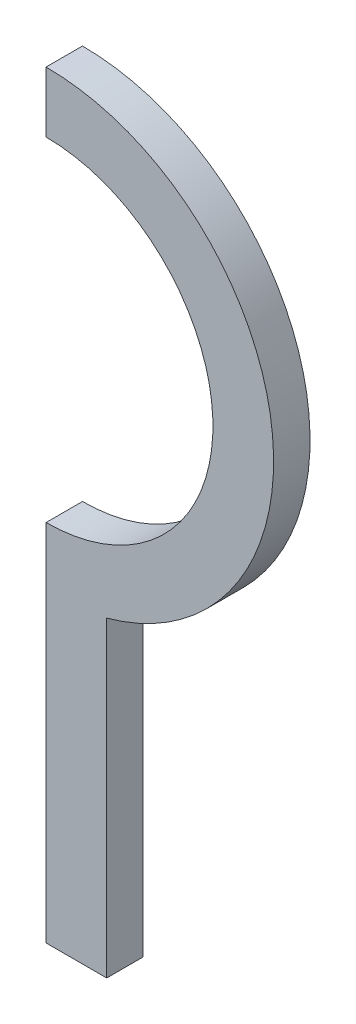
ISO-10303-21;
HEADER;
FILE_DESCRIPTION(('STEP AP214'),'2;1');
FILE_NAME('part.step','',(''),(''),'','','');
FILE_SCHEMA(('AUTOMOTIVE_DESIGN { 1 0 10303 214 1 1 1 1 }'));
ENDSEC;
DATA;
#1=APPLICATION_CONTEXT('core data for automotive mechanical design processes');
#2=APPLICATION_PROTOCOL_DEFINITION('international standard','automotive_design',2000,#1);
#3=PRODUCT_CONTEXT('',#1,'mechanical');
#4=PRODUCT('Part','Part','',(#3));
#5=PRODUCT_RELATED_PRODUCT_CATEGORY('part','',(#4));
#6=PRODUCT_DEFINITION_FORMATION('','',#4);
#7=PRODUCT_DEFINITION_CONTEXT('part definition',#1,'design');
#8=PRODUCT_DEFINITION('design','',#6,#7);
#9=PRODUCT_DEFINITION_SHAPE('','',#8);
#10=(LENGTH_UNIT() NAMED_UNIT(*) SI_UNIT(.MILLI.,.METRE.));
#11=(NAMED_UNIT(*) PLANE_ANGLE_UNIT() SI_UNIT($,.RADIAN.));
#12=(NAMED_UNIT(*) SI_UNIT($,.STERADIAN.) SOLID_ANGLE_UNIT());
#13=UNCERTAINTY_MEASURE_WITH_UNIT(LENGTH_MEASURE(1.E-05),#10,'distance_accuracy_value','');
#14=(GEOMETRIC_REPRESENTATION_CONTEXT(3) GLOBAL_UNCERTAINTY_ASSIGNED_CONTEXT((#13)) GLOBAL_UNIT_ASSIGNED_CONTEXT((#10,
#11,#12)) REPRESENTATION_CONTEXT('',''));
#15=CARTESIAN_POINT('',(0.,0.,0.));
#16=DIRECTION('',(0.,0.,1.));
#17=DIRECTION('',(1.,0.,0.));
#18=AXIS2_PLACEMENT_3D('',#15,#16,#17);
#19=CARTESIAN_POINT('',(5.,-25.,6.));
#20=DIRECTION('',(0.,1.,0.));
#21=DIRECTION('',(0.,0.,1.));
#22=AXIS2_PLACEMENT_3D('',#19,#20,#21);
#23=PLANE('',#22);
#24=DIRECTION('',(1.,0.,0.));
#25=VECTOR('',#24,1.);
#26=CARTESIAN_POINT('',(5.,-25.,0.));
#27=LINE('',#26,#25);
#28=CARTESIAN_POINT('',(-5.,-25.,0.));
#29=VERTEX_POINT('',#28);
#30=CARTESIAN_POINT('',(5.,-25.,0.));
#31=VERTEX_POINT('',#30);
#32=EDGE_CURVE('E127',#29,#31,#27,.T.);
#33=ORIENTED_EDGE('',*,*,#32,.T.);
#34=DIRECTION('',(0.,0.,-1.));
#35=VECTOR('',#34,1.);
#36=CARTESIAN_POINT('',(5.,-25.,6.));
#37=LINE('',#36,#35);
#38=CARTESIAN_POINT('',(5.,-25.,6.));
#39=VERTEX_POINT('',#38);
#40=EDGE_CURVE('E11',#39,#31,#37,.T.);
#41=ORIENTED_EDGE('',*,*,#40,.F.);
#42=DIRECTION('',(1.,0.,0.));
#43=VECTOR('',#42,1.);
#44=CARTESIAN_POINT('',(5.,-25.,6.));
#45=LINE('',#44,#43);
#46=CARTESIAN_POINT('',(-5.,-25.,6.));
#47=VERTEX_POINT('',#46);
#48=EDGE_CURVE('E138',#47,#39,#45,.T.);
#49=ORIENTED_EDGE('',*,*,#48,.F.);
#50=DIRECTION('',(0.,0.,-1.));
#51=VECTOR('',#50,1.);
#52=CARTESIAN_POINT('',(-5.,-25.,6.));
#53=LINE('',#52,#51);
#54=EDGE_CURVE('E123',#47,#29,#53,.T.);
#55=ORIENTED_EDGE('',*,*,#54,.T.);
#56=EDGE_LOOP('',(#33,#41,#49,#55));
#57=FACE_BOUND('',#56,.T.);
#58=ADVANCED_FACE('F42',(#57),#23,.F.);
#59=CARTESIAN_POINT('',(5.,25.,6.));
#60=DIRECTION('',(-1.,0.,0.));
#61=DIRECTION('',(0.,-1.,0.));
#62=AXIS2_PLACEMENT_3D('',#59,#60,#61);
#63=PLANE('',#62);
#64=DIRECTION('',(0.,1.,0.));
#65=VECTOR('',#64,1.);
#66=CARTESIAN_POINT('',(5.,25.,0.));
#67=LINE('',#66,#65);
#68=CARTESIAN_POINT('',(4.99999999999998,26.3579192629976,0.));
#69=VERTEX_POINT('',#68);
#70=EDGE_CURVE('E130',#31,#69,#67,.T.);
#71=ORIENTED_EDGE('',*,*,#70,.T.);
#72=DIRECTION('',(0.,0.,-1.));
#73=VECTOR('',#72,1.);
#74=CARTESIAN_POINT('',(4.99999999999998,26.3579192629976,6.));
#75=LINE('',#74,#73);
#76=CARTESIAN_POINT('',(4.99999999999998,26.3579192629976,6.));
#77=VERTEX_POINT('',#76);
#78=EDGE_CURVE('E50',#77,#69,#75,.T.);
#79=ORIENTED_EDGE('',*,*,#78,.F.);
#80=DIRECTION('',(0.,1.,0.));
#81=VECTOR('',#80,1.);
#82=CARTESIAN_POINT('',(5.,25.,6.));
#83=LINE('',#82,#81);
#84=EDGE_CURVE('E93',#39,#77,#83,.T.);
#85=ORIENTED_EDGE('',*,*,#84,.F.);
#86=ORIENTED_EDGE('',*,*,#40,.T.);
#87=EDGE_LOOP('',(#71,#79,#85,#86));
#88=FACE_BOUND('',#87,.T.);
#89=ADVANCED_FACE('F152',(#88),#63,.F.);
#90=CARTESIAN_POINT('',(-5.00000000000001,62.5,6.));
#91=DIRECTION('',(0.,0.,-1.));
#92=DIRECTION('',(-1.,0.,0.));
#93=AXIS2_PLACEMENT_3D('',#90,#91,#92);
#94=CYLINDRICAL_SURFACE('',#93,37.5);
#95=CARTESIAN_POINT('',(-5.00000000000001,62.5,0.));
#96=DIRECTION('',(0.,0.,1.));
#97=DIRECTION('',(1.,0.,0.));
#98=AXIS2_PLACEMENT_3D('',#95,#96,#97);
#99=CIRCLE('',#98,37.5);
#100=CARTESIAN_POINT('',(-5.00000000000001,100.,0.));
#101=VERTEX_POINT('',#100);
#102=EDGE_CURVE('E132',#69,#101,#99,.T.);
#103=ORIENTED_EDGE('',*,*,#102,.T.);
#104=DIRECTION('',(0.,0.,-1.));
#105=VECTOR('',#104,1.);
#106=CARTESIAN_POINT('',(-5.00000000000001,100.,6.));
#107=LINE('',#106,#105);
#108=CARTESIAN_POINT('',(-5.00000000000001,100.,6.));
#109=VERTEX_POINT('',#108);
#110=EDGE_CURVE('E118',#109,#101,#107,.T.);
#111=ORIENTED_EDGE('',*,*,#110,.F.);
#112=CARTESIAN_POINT('',(-5.00000000000001,62.5,6.));
#113=DIRECTION('',(0.,0.,1.));
#114=DIRECTION('',(1.,0.,0.));
#115=AXIS2_PLACEMENT_3D('',#112,#113,#114);
#116=CIRCLE('',#115,37.5);
#117=EDGE_CURVE('E107',#77,#109,#116,.T.);
#118=ORIENTED_EDGE('',*,*,#117,.F.);
#119=ORIENTED_EDGE('',*,*,#78,.T.);
#120=EDGE_LOOP('',(#103,#111,#118,#119));
#121=FACE_BOUND('',#120,.T.);
#122=ADVANCED_FACE('F144',(#121),#94,.T.);
#123=CARTESIAN_POINT('',(-5.00000000000001,90.,6.));
#124=DIRECTION('',(1.,0.,0.));
#125=DIRECTION('',(0.,0.,-1.));
#126=AXIS2_PLACEMENT_3D('',#123,#124,#125);
#127=PLANE('',#126);
#128=DIRECTION('',(0.,-1.,0.));
#129=VECTOR('',#128,1.);
#130=CARTESIAN_POINT('',(-5.00000000000001,90.,0.));
#131=LINE('',#130,#129);
#132=CARTESIAN_POINT('',(-5.00000000000001,90.,0.));
#133=VERTEX_POINT('',#132);
#134=EDGE_CURVE('E116',#101,#133,#131,.T.);
#135=ORIENTED_EDGE('',*,*,#134,.T.);
#136=DIRECTION('',(0.,0.,-1.));
#137=VECTOR('',#136,1.);
#138=CARTESIAN_POINT('',(-5.00000000000001,90.,6.));
#139=LINE('',#138,#137);
#140=CARTESIAN_POINT('',(-5.00000000000001,90.,6.));
#141=VERTEX_POINT('',#140);
#142=EDGE_CURVE('E113',#141,#133,#139,.T.);
#143=ORIENTED_EDGE('',*,*,#142,.F.);
#144=DIRECTION('',(0.,-1.,0.));
#145=VECTOR('',#144,1.);
#146=CARTESIAN_POINT('',(-5.00000000000001,90.,6.));
#147=LINE('',#146,#145);
#148=EDGE_CURVE('E100',#109,#141,#147,.T.);
#149=ORIENTED_EDGE('',*,*,#148,.F.);
#150=ORIENTED_EDGE('',*,*,#110,.T.);
#151=EDGE_LOOP('',(#135,#143,#149,#150));
#152=FACE_BOUND('',#151,.T.);
#153=ADVANCED_FACE('F114',(#152),#127,.F.);
#154=CARTESIAN_POINT('',(-5.00000000000001,62.5,6.));
#155=DIRECTION('',(0.,0.,-1.));
#156=DIRECTION('',(-1.,0.,0.));
#157=AXIS2_PLACEMENT_3D('',#154,#155,#156);
#158=CYLINDRICAL_SURFACE('',#157,27.5);
#159=CARTESIAN_POINT('',(-5.00000000000001,62.5,0.));
#160=DIRECTION('',(0.,0.,-1.));
#161=DIRECTION('',(1.,0.,0.));
#162=AXIS2_PLACEMENT_3D('',#159,#160,#161);
#163=CIRCLE('',#162,27.5);
#164=CARTESIAN_POINT('',(-5.00000000000001,35.,0.));
#165=VERTEX_POINT('',#164);
#166=EDGE_CURVE('E135',#133,#165,#163,.T.);
#167=ORIENTED_EDGE('',*,*,#166,.T.);
#168=DIRECTION('',(0.,0.,-1.));
#169=VECTOR('',#168,1.);
#170=CARTESIAN_POINT('',(-5.00000000000001,35.,6.));
#171=LINE('',#170,#169);
#172=CARTESIAN_POINT('',(-5.00000000000001,35.,6.));
#173=VERTEX_POINT('',#172);
#174=EDGE_CURVE('E119',#173,#165,#171,.T.);
#175=ORIENTED_EDGE('',*,*,#174,.F.);
#176=CARTESIAN_POINT('',(-5.00000000000001,62.5,6.));
#177=DIRECTION('',(0.,0.,-1.));
#178=DIRECTION('',(1.,0.,0.));
#179=AXIS2_PLACEMENT_3D('',#176,#177,#178);
#180=CIRCLE('',#179,27.5);
#181=EDGE_CURVE('E104',#141,#173,#180,.T.);
#182=ORIENTED_EDGE('',*,*,#181,.F.);
#183=ORIENTED_EDGE('',*,*,#142,.T.);
#184=EDGE_LOOP('',(#167,#175,#182,#183));
#185=FACE_BOUND('',#184,.T.);
#186=ADVANCED_FACE('F121',(#185),#158,.F.);
#187=CARTESIAN_POINT('',(-5.,25.,6.));
#188=DIRECTION('',(1.,0.,0.));
#189=DIRECTION('',(0.,1.,0.));
#190=AXIS2_PLACEMENT_3D('',#187,#188,#189);
#191=PLANE('',#190);
#192=DIRECTION('',(0.,-1.,0.));
#193=VECTOR('',#192,1.);
#194=CARTESIAN_POINT('',(-5.,25.,0.));
#195=LINE('',#194,#193);
#196=EDGE_CURVE('E81',#165,#29,#195,.T.);
#197=ORIENTED_EDGE('',*,*,#196,.T.);
#198=ORIENTED_EDGE('',*,*,#54,.F.);
#199=DIRECTION('',(0.,-1.,0.));
#200=VECTOR('',#199,1.);
#201=CARTESIAN_POINT('',(-5.,25.,6.));
#202=LINE('',#201,#200);
#203=EDGE_CURVE('E58',#173,#47,#202,.T.);
#204=ORIENTED_EDGE('',*,*,#203,.F.);
#205=ORIENTED_EDGE('',*,*,#174,.T.);
#206=EDGE_LOOP('',(#197,#198,#204,#205));
#207=FACE_BOUND('',#206,.T.);
#208=ADVANCED_FACE('F146',(#207),#191,.F.);
#209=CARTESIAN_POINT('',(-5.00000000000001,62.5,6.));
#210=DIRECTION('',(0.,0.,1.));
#211=DIRECTION('',(1.,0.,0.));
#212=AXIS2_PLACEMENT_3D('',#209,#210,#211);
#213=PLANE('',#212);
#214=ORIENTED_EDGE('',*,*,#48,.T.);
#215=ORIENTED_EDGE('',*,*,#84,.T.);
#216=ORIENTED_EDGE('',*,*,#117,.T.);
#217=ORIENTED_EDGE('',*,*,#148,.T.);
#218=ORIENTED_EDGE('',*,*,#181,.T.);
#219=ORIENTED_EDGE('',*,*,#203,.T.);
#220=EDGE_LOOP('',(#214,#215,#216,#217,#218,#219));
#221=FACE_BOUND('',#220,.T.);
#222=ADVANCED_FACE('F102',(#221),#213,.T.);
#223=CARTESIAN_POINT('',(-5.00000000000001,62.5,0.));
#224=DIRECTION('',(0.,0.,1.));
#225=DIRECTION('',(1.,0.,0.));
#226=AXIS2_PLACEMENT_3D('',#223,#224,#225);
#227=PLANE('',#226);
#228=ORIENTED_EDGE('',*,*,#32,.F.);
#229=ORIENTED_EDGE('',*,*,#196,.F.);
#230=ORIENTED_EDGE('',*,*,#166,.F.);
#231=ORIENTED_EDGE('',*,*,#134,.F.);
#232=ORIENTED_EDGE('',*,*,#102,.F.);
#233=ORIENTED_EDGE('',*,*,#70,.F.);
#234=EDGE_LOOP('',(#228,#229,#230,#231,#232,#233));
#235=FACE_BOUND('',#234,.T.);
#236=ADVANCED_FACE('F145',(#235),#227,.F.);
#237=CLOSED_SHELL('',(#58,#89,#122,#153,#186,#208,#222,#236));
#238=MANIFOLD_SOLID_BREP('B2',#237);
#239=ADVANCED_BREP_SHAPE_REPRESENTATION('',(#18,#238),#14);
#240=SHAPE_DEFINITION_REPRESENTATION(#9,#239);
ENDSEC;
END-ISO-10303-21;
